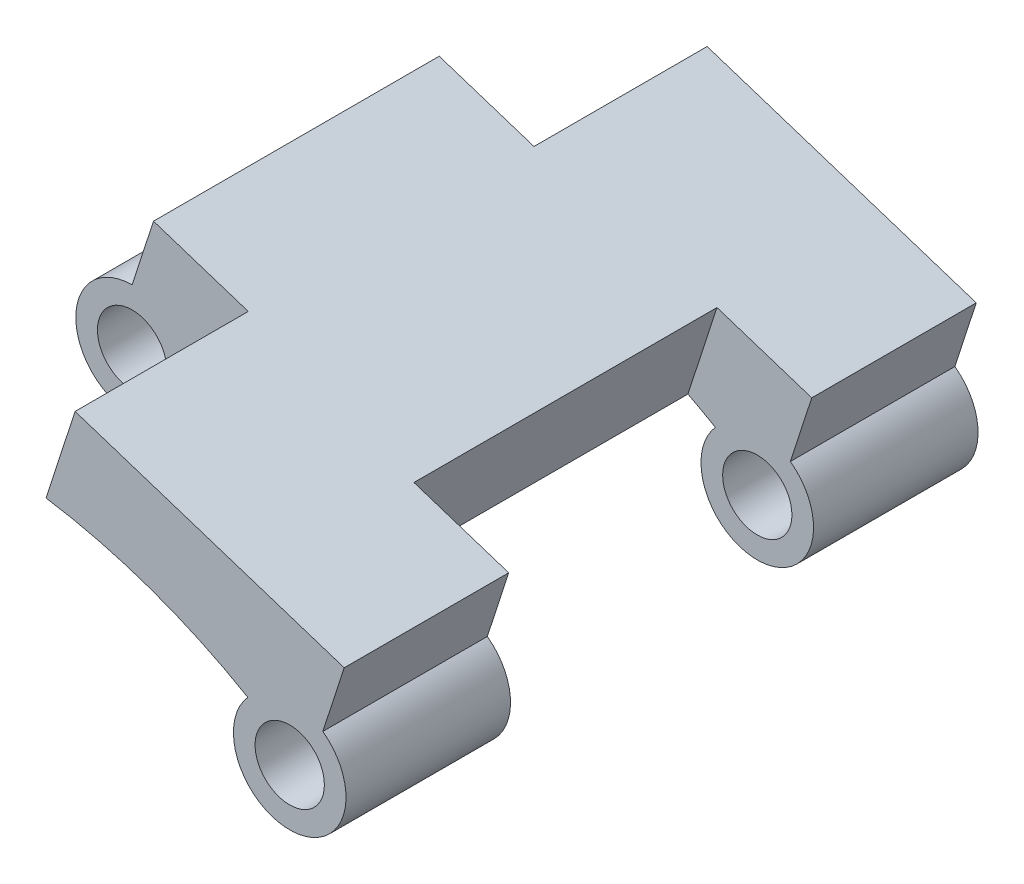
ISO-10303-21;
HEADER;
FILE_DESCRIPTION(('STEP AP214'),'2;1');
FILE_NAME('part.step','',(''),(''),'','','');
FILE_SCHEMA(('AUTOMOTIVE_DESIGN { 1 0 10303 214 1 1 1 1 }'));
ENDSEC;
DATA;
#1=APPLICATION_CONTEXT('core data for automotive mechanical design processes');
#2=APPLICATION_PROTOCOL_DEFINITION('international standard','automotive_design',2000,#1);
#3=PRODUCT_CONTEXT('',#1,'mechanical');
#4=PRODUCT('Part','Part','',(#3));
#5=PRODUCT_RELATED_PRODUCT_CATEGORY('part','',(#4));
#6=PRODUCT_DEFINITION_FORMATION('','',#4);
#7=PRODUCT_DEFINITION_CONTEXT('part definition',#1,'design');
#8=PRODUCT_DEFINITION('design','',#6,#7);
#9=PRODUCT_DEFINITION_SHAPE('','',#8);
#10=(LENGTH_UNIT() NAMED_UNIT(*) SI_UNIT(.MILLI.,.METRE.));
#11=(NAMED_UNIT(*) PLANE_ANGLE_UNIT() SI_UNIT($,.RADIAN.));
#12=(NAMED_UNIT(*) SI_UNIT($,.STERADIAN.) SOLID_ANGLE_UNIT());
#13=UNCERTAINTY_MEASURE_WITH_UNIT(LENGTH_MEASURE(1.E-05),#10,'distance_accuracy_value','');
#14=(GEOMETRIC_REPRESENTATION_CONTEXT(3) GLOBAL_UNCERTAINTY_ASSIGNED_CONTEXT((#13)) GLOBAL_UNIT_ASSIGNED_CONTEXT((#10,
#11,#12)) REPRESENTATION_CONTEXT('',''));
#15=CARTESIAN_POINT('',(0.,0.,0.));
#16=DIRECTION('',(0.,0.,1.));
#17=DIRECTION('',(1.,0.,0.));
#18=AXIS2_PLACEMENT_3D('',#15,#16,#17);
#19=CARTESIAN_POINT('',(6.54378432662025,33.5383952836735,-30.));
#20=DIRECTION('',(0.,0.,1.));
#21=DIRECTION('',(1.,0.,0.));
#22=AXIS2_PLACEMENT_3D('',#19,#20,#21);
#23=CYLINDRICAL_SURFACE('',#22,2.);
#24=CARTESIAN_POINT('',(6.54378432662025,33.5383952836735,-3.5));
#25=DIRECTION('',(0.,0.,-1.));
#26=DIRECTION('',(-1.,0.,0.));
#27=AXIS2_PLACEMENT_3D('',#24,#25,#26);
#28=CIRCLE('',#27,2.);
#29=CARTESIAN_POINT('',(4.54378432662025,33.5383952836735,-3.5));
#30=VERTEX_POINT('',#29);
#31=EDGE_CURVE('E305',#30,#30,#28,.F.);
#32=ORIENTED_EDGE('',*,*,#31,.T.);
#33=EDGE_LOOP('',(#32));
#34=FACE_BOUND('',#33,.T.);
#35=CARTESIAN_POINT('',(6.54378432662025,33.5383952836735,-20.));
#36=DIRECTION('',(0.,0.,1.));
#37=DIRECTION('',(1.,0.,0.));
#38=AXIS2_PLACEMENT_3D('',#35,#36,#37);
#39=CIRCLE('',#38,2.);
#40=CARTESIAN_POINT('',(8.54378432662025,33.5383952836735,-20.));
#41=VERTEX_POINT('',#40);
#42=EDGE_CURVE('E301',#41,#41,#39,.F.);
#43=ORIENTED_EDGE('',*,*,#42,.T.);
#44=EDGE_LOOP('',(#43));
#45=FACE_BOUND('',#44,.T.);
#46=ADVANCED_FACE('F118',(#34,#45),#23,.F.);
#47=CARTESIAN_POINT('',(-0.536270226362876,22.2654488705289,-3.5));
#48=DIRECTION('',(0.,0.,-1.));
#49=DIRECTION('',(-1.,0.,0.));
#50=AXIS2_PLACEMENT_3D('',#47,#48,#49);
#51=PLANE('',#50);
#52=ORIENTED_EDGE('',*,*,#31,.F.);
#53=EDGE_LOOP('',(#52));
#54=FACE_BOUND('',#53,.T.);
#55=CARTESIAN_POINT('',(6.54378432662025,33.5383952836735,-3.5));
#56=DIRECTION('',(0.,0.,-1.));
#57=DIRECTION('',(-1.,0.,0.));
#58=AXIS2_PLACEMENT_3D('',#55,#56,#57);
#59=CIRCLE('',#58,3.24999999999999);
#60=CARTESIAN_POINT('',(6.54378432662025,36.7883952836734,-3.5));
#61=VERTEX_POINT('',#60);
#62=CARTESIAN_POINT('',(9.77675310371405,33.8706796292821,-3.5));
#63=VERTEX_POINT('',#62);
#64=EDGE_CURVE('E308',#61,#63,#59,.F.);
#65=ORIENTED_EDGE('',*,*,#64,.T.);
#66=CARTESIAN_POINT('',(6.54378432662025,1.03839528367346,-3.5));
#67=DIRECTION('',(0.,0.,-1.));
#68=DIRECTION('',(-1.,0.,0.));
#69=AXIS2_PLACEMENT_3D('',#66,#67,#68);
#70=CIRCLE('',#69,32.9910742847905);
#71=CARTESIAN_POINT('',(11.5725292331081,33.6439578019008,-3.5));
#72=VERTEX_POINT('',#71);
#73=EDGE_CURVE('E353',#72,#63,#70,.F.);
#74=ORIENTED_EDGE('',*,*,#73,.F.);
#75=DIRECTION('',(0.309016994374947,0.951056516295154,0.));
#76=VECTOR('',#75,1.);
#77=CARTESIAN_POINT('',(7.07218190399835,19.7933129155293,-3.5));
#78=LINE('',#77,#76);
#79=CARTESIAN_POINT('',(13.2525217914973,38.8144432414324,-3.5));
#80=VERTEX_POINT('',#79);
#81=EDGE_CURVE('E369',#72,#80,#78,.T.);
#82=ORIENTED_EDGE('',*,*,#81,.T.);
#83=DIRECTION('',(-0.951056516295154,0.309016994374947,0.));
#84=VECTOR('',#83,1.);
#85=CARTESIAN_POINT('',(5.64406966113607,41.2865791964319,-3.5));
#86=LINE('',#85,#84);
#87=CARTESIAN_POINT('',(7.77985230412004,40.5926213488541,-3.5));
#88=VERTEX_POINT('',#87);
#89=EDGE_CURVE('E246',#80,#88,#86,.T.);
#90=ORIENTED_EDGE('',*,*,#89,.T.);
#91=DIRECTION('',(0.309016994374947,0.951056516295154,0.));
#92=VECTOR('',#91,1.);
#93=CARTESIAN_POINT('',(6.54378432662025,36.7883952836735,-3.5));
#94=LINE('',#93,#92);
#95=EDGE_CURVE('E313',#61,#88,#94,.T.);
#96=ORIENTED_EDGE('',*,*,#95,.F.);
#97=EDGE_LOOP('',(#65,#74,#82,#90,#96));
#98=FACE_BOUND('',#97,.T.);
#99=ADVANCED_FACE('F381',(#54,#98),#51,.F.);
#100=CARTESIAN_POINT('',(7.07218190399835,19.7933129155293,6.5));
#101=DIRECTION('',(0.951056516295154,-0.309016994374947,0.));
#102=DIRECTION('',(0.309016994374947,0.951056516295154,0.));
#103=AXIS2_PLACEMENT_3D('',#100,#101,#102);
#104=PLANE('',#103);
#105=DIRECTION('',(0.309016994374947,0.951056516295154,0.));
#106=VECTOR('',#105,1.);
#107=CARTESIAN_POINT('',(11.0613027790222,32.0705645603925,6.5));
#108=LINE('',#107,#106);
#109=CARTESIAN_POINT('',(11.5725292331081,33.6439578019008,6.5));
#110=VERTEX_POINT('',#109);
#111=CARTESIAN_POINT('',(13.2525217914973,38.8144432414324,6.5));
#112=VERTEX_POINT('',#111);
#113=EDGE_CURVE('E126',#110,#112,#108,.T.);
#114=ORIENTED_EDGE('',*,*,#113,.T.);
#115=DIRECTION('',(0.,0.,-1.));
#116=VECTOR('',#115,1.);
#117=CARTESIAN_POINT('',(13.2525217914973,38.8144432414324,6.5));
#118=LINE('',#117,#116);
#119=EDGE_CURVE('E229',#112,#80,#118,.T.);
#120=ORIENTED_EDGE('',*,*,#119,.T.);
#121=ORIENTED_EDGE('',*,*,#81,.F.);
#122=DIRECTION('',(0.,0.,1.));
#123=VECTOR('',#122,1.);
#124=CARTESIAN_POINT('',(11.5725292331081,33.6439578019008,-30.));
#125=LINE('',#124,#123);
#126=EDGE_CURVE('E232',#110,#72,#125,.F.);
#127=ORIENTED_EDGE('',*,*,#126,.F.);
#128=EDGE_LOOP('',(#114,#120,#121,#127));
#129=FACE_BOUND('',#128,.T.);
#130=ADVANCED_FACE('F227',(#129),#104,.F.);
#131=CARTESIAN_POINT('',(7.07218190399835,19.7933129155293,-30.));
#132=DIRECTION('',(0.951056516295154,-0.309016994374947,0.));
#133=DIRECTION('',(0.309016994374947,0.951056516295154,0.));
#134=AXIS2_PLACEMENT_3D('',#131,#132,#133);
#135=PLANE('',#134);
#136=DIRECTION('',(0.309016994374947,0.951056516295154,0.));
#137=VECTOR('',#136,1.);
#138=CARTESIAN_POINT('',(7.07218190399836,19.7933129155293,-20.));
#139=LINE('',#138,#137);
#140=CARTESIAN_POINT('',(11.5725292331081,33.6439578019008,-20.));
#141=VERTEX_POINT('',#140);
#142=CARTESIAN_POINT('',(13.2525217914973,38.8144432414324,-20.));
#143=VERTEX_POINT('',#142);
#144=EDGE_CURVE('E362',#141,#143,#139,.T.);
#145=ORIENTED_EDGE('',*,*,#144,.T.);
#146=DIRECTION('',(0.,0.,-1.));
#147=VECTOR('',#146,1.);
#148=CARTESIAN_POINT('',(13.2525217914973,38.8144432414324,-30.));
#149=LINE('',#148,#147);
#150=CARTESIAN_POINT('',(13.2525217914973,38.8144432414324,-30.));
#151=VERTEX_POINT('',#150);
#152=EDGE_CURVE('E141',#143,#151,#149,.T.);
#153=ORIENTED_EDGE('',*,*,#152,.T.);
#154=DIRECTION('',(0.309016994374947,0.951056516295154,0.));
#155=VECTOR('',#154,1.);
#156=CARTESIAN_POINT('',(7.07218190399835,19.7933129155293,-30.));
#157=LINE('',#156,#155);
#158=CARTESIAN_POINT('',(11.5725292331081,33.6439578019008,-30.));
#159=VERTEX_POINT('',#158);
#160=EDGE_CURVE('E345',#159,#151,#157,.T.);
#161=ORIENTED_EDGE('',*,*,#160,.F.);
#162=DIRECTION('',(0.,0.,1.));
#163=VECTOR('',#162,1.);
#164=CARTESIAN_POINT('',(11.5725292331081,33.6439578019008,-30.));
#165=LINE('',#164,#163);
#166=EDGE_CURVE('E260',#141,#159,#165,.F.);
#167=ORIENTED_EDGE('',*,*,#166,.F.);
#168=EDGE_LOOP('',(#145,#153,#161,#167));
#169=FACE_BOUND('',#168,.T.);
#170=ADVANCED_FACE('F507',(#169),#135,.F.);
#171=CARTESIAN_POINT('',(-0.536270226362874,22.2654488705289,-20.));
#172=DIRECTION('',(0.,0.,1.));
#173=DIRECTION('',(1.,0.,0.));
#174=AXIS2_PLACEMENT_3D('',#171,#172,#173);
#175=PLANE('',#174);
#176=ORIENTED_EDGE('',*,*,#42,.F.);
#177=EDGE_LOOP('',(#176));
#178=FACE_BOUND('',#177,.T.);
#179=DIRECTION('',(0.951056516295154,-0.309016994374947,0.));
#180=VECTOR('',#179,1.);
#181=CARTESIAN_POINT('',(5.64406966113607,41.2865791964319,-20.));
#182=LINE('',#181,#180);
#183=CARTESIAN_POINT('',(7.77985230412004,40.5926213488541,-20.));
#184=VERTEX_POINT('',#183);
#185=EDGE_CURVE('E366',#184,#143,#182,.T.);
#186=ORIENTED_EDGE('',*,*,#185,.T.);
#187=ORIENTED_EDGE('',*,*,#144,.F.);
#188=CARTESIAN_POINT('',(6.54378432662025,1.03839528367346,-20.));
#189=DIRECTION('',(0.,0.,1.));
#190=DIRECTION('',(1.,0.,0.));
#191=AXIS2_PLACEMENT_3D('',#188,#189,#190);
#192=CIRCLE('',#191,32.9910742847905);
#193=CARTESIAN_POINT('',(9.77675310371405,33.8706796292821,-20.));
#194=VERTEX_POINT('',#193);
#195=EDGE_CURVE('E340',#194,#141,#192,.F.);
#196=ORIENTED_EDGE('',*,*,#195,.F.);
#197=CARTESIAN_POINT('',(6.54378432662025,33.5383952836735,-20.));
#198=DIRECTION('',(0.,0.,1.));
#199=DIRECTION('',(1.,0.,0.));
#200=AXIS2_PLACEMENT_3D('',#197,#198,#199);
#201=CIRCLE('',#200,3.24999999999999);
#202=CARTESIAN_POINT('',(6.54378432662025,36.7883952836734,-20.));
#203=VERTEX_POINT('',#202);
#204=EDGE_CURVE('E304',#194,#203,#201,.F.);
#205=ORIENTED_EDGE('',*,*,#204,.T.);
#206=DIRECTION('',(-0.309016994374947,-0.951056516295154,0.));
#207=VECTOR('',#206,1.);
#208=CARTESIAN_POINT('',(6.54378432662025,36.7883952836735,-20.));
#209=LINE('',#208,#207);
#210=EDGE_CURVE('E309',#184,#203,#209,.T.);
#211=ORIENTED_EDGE('',*,*,#210,.F.);
#212=EDGE_LOOP('',(#186,#187,#196,#205,#211));
#213=FACE_BOUND('',#212,.T.);
#214=ADVANCED_FACE('F388',(#178,#213),#175,.F.);
#215=CARTESIAN_POINT('',(25.6468050261256,27.3314476008593,-30.));
#216=DIRECTION('',(0.,0.,1.));
#217=DIRECTION('',(1.,0.,0.));
#218=AXIS2_PLACEMENT_3D('',#215,#216,#217);
#219=CYLINDRICAL_SURFACE('',#218,2.);
#220=CARTESIAN_POINT('',(25.6468050261256,27.3314476008593,-20.5));
#221=DIRECTION('',(0.,0.,-1.));
#222=DIRECTION('',(-1.,0.,0.));
#223=AXIS2_PLACEMENT_3D('',#220,#221,#222);
#224=CIRCLE('',#223,2.);
#225=CARTESIAN_POINT('',(23.6468050261256,27.3314476008593,-20.5));
#226=VERTEX_POINT('',#225);
#227=EDGE_CURVE('E310',#226,#226,#224,.F.);
#228=ORIENTED_EDGE('',*,*,#227,.T.);
#229=EDGE_LOOP('',(#228));
#230=FACE_BOUND('',#229,.T.);
#231=CARTESIAN_POINT('',(25.6468050261256,27.3314476008593,-30.));
#232=DIRECTION('',(0.,0.,1.));
#233=DIRECTION('',(1.,0.,0.));
#234=AXIS2_PLACEMENT_3D('',#231,#232,#233);
#235=CIRCLE('',#234,2.);
#236=CARTESIAN_POINT('',(27.6468050261256,27.3314476008593,-30.));
#237=VERTEX_POINT('',#236);
#238=EDGE_CURVE('E267',#237,#237,#235,.T.);
#239=ORIENTED_EDGE('',*,*,#238,.F.);
#240=EDGE_LOOP('',(#239));
#241=FACE_BOUND('',#240,.T.);
#242=ADVANCED_FACE('F430',(#230,#241),#219,.F.);
#243=CARTESIAN_POINT('',(25.6468050261256,27.3314476008593,-30.));
#244=DIRECTION('',(0.,0.,1.));
#245=DIRECTION('',(1.,0.,0.));
#246=AXIS2_PLACEMENT_3D('',#243,#244,#245);
#247=PLANE('',#246);
#248=ORIENTED_EDGE('',*,*,#238,.T.);
#249=EDGE_LOOP('',(#248));
#250=FACE_BOUND('',#249,.T.);
#251=CARTESIAN_POINT('',(6.54378432662025,1.03839528367346,-30.));
#252=DIRECTION('',(0.,0.,1.));
#253=DIRECTION('',(1.,0.,0.));
#254=AXIS2_PLACEMENT_3D('',#251,#252,#253);
#255=CIRCLE('',#254,32.9910742847905);
#256=CARTESIAN_POINT('',(23.2265901810896,29.5005626517192,-30.));
#257=VERTEX_POINT('',#256);
#258=EDGE_CURVE('E279',#257,#159,#255,.T.);
#259=ORIENTED_EDGE('',*,*,#258,.T.);
#260=ORIENTED_EDGE('',*,*,#160,.T.);
#261=DIRECTION('',(-0.951056516295154,0.309016994374947,0.));
#262=VECTOR('',#261,1.);
#263=CARTESIAN_POINT('',(28.793175073576,33.7649788977584,-30.));
#264=LINE('',#263,#262);
#265=CARTESIAN_POINT('',(28.793175073576,33.7649788977584,-30.));
#266=VERTEX_POINT('',#265);
#267=EDGE_CURVE('E270',#266,#151,#264,.T.);
#268=ORIENTED_EDGE('',*,*,#267,.F.);
#269=DIRECTION('',(0.309016994374948,0.951056516295154,0.));
#270=VECTOR('',#269,1.);
#271=CARTESIAN_POINT('',(27.5571070960762,29.9607528325778,-30.));
#272=LINE('',#271,#270);
#273=CARTESIAN_POINT('',(27.5571070960762,29.9607528325778,-30.));
#274=VERTEX_POINT('',#273);
#275=EDGE_CURVE('E273',#274,#266,#272,.T.);
#276=ORIENTED_EDGE('',*,*,#275,.F.);
#277=CARTESIAN_POINT('',(25.6468050261256,27.3314476008593,-30.));
#278=DIRECTION('',(0.,0.,1.));
#279=DIRECTION('',(1.,0.,0.));
#280=AXIS2_PLACEMENT_3D('',#277,#278,#279);
#281=CIRCLE('',#280,3.25);
#282=EDGE_CURVE('E276',#257,#274,#281,.T.);
#283=ORIENTED_EDGE('',*,*,#282,.F.);
#284=EDGE_LOOP('',(#259,#260,#268,#276,#283));
#285=FACE_BOUND('',#284,.T.);
#286=ADVANCED_FACE('F343',(#250,#285),#247,.F.);
#287=CARTESIAN_POINT('',(6.54378432662025,33.5383952836735,-30.));
#288=DIRECTION('',(0.,0.,1.));
#289=DIRECTION('',(1.,0.,0.));
#290=AXIS2_PLACEMENT_3D('',#287,#288,#289);
#291=CYLINDRICAL_SURFACE('',#290,3.24999999999999);
#292=DIRECTION('',(0.,0.,1.));
#293=VECTOR('',#292,1.);
#294=CARTESIAN_POINT('',(9.77675310371405,33.8706796292821,-30.));
#295=LINE('',#294,#293);
#296=EDGE_CURVE('E285',#194,#63,#295,.T.);
#297=ORIENTED_EDGE('',*,*,#296,.T.);
#298=ORIENTED_EDGE('',*,*,#64,.F.);
#299=DIRECTION('',(0.,0.,1.));
#300=VECTOR('',#299,1.);
#301=CARTESIAN_POINT('',(6.54378432662025,36.7883952836734,-30.));
#302=LINE('',#301,#300);
#303=EDGE_CURVE('E282',#203,#61,#302,.T.);
#304=ORIENTED_EDGE('',*,*,#303,.F.);
#305=ORIENTED_EDGE('',*,*,#204,.F.);
#306=EDGE_LOOP('',(#297,#298,#304,#305));
#307=FACE_BOUND('',#306,.T.);
#308=ADVANCED_FACE('F390',(#307),#291,.T.);
#309=CARTESIAN_POINT('',(25.6468050261256,27.3314476008593,6.5));
#310=DIRECTION('',(0.,0.,1.));
#311=DIRECTION('',(1.,0.,0.));
#312=AXIS2_PLACEMENT_3D('',#309,#310,#311);
#313=PLANE('',#312);
#314=ORIENTED_EDGE('',*,*,#113,.F.);
#315=CARTESIAN_POINT('',(6.54378432662025,1.03839528367346,6.5));
#316=DIRECTION('',(0.,0.,1.));
#317=DIRECTION('',(1.,0.,0.));
#318=AXIS2_PLACEMENT_3D('',#315,#316,#317);
#319=CIRCLE('',#318,32.9910742847905);
#320=CARTESIAN_POINT('',(23.2265901810896,29.5005626517192,6.5));
#321=VERTEX_POINT('',#320);
#322=EDGE_CURVE('E265',#321,#110,#319,.T.);
#323=ORIENTED_EDGE('',*,*,#322,.F.);
#324=CARTESIAN_POINT('',(25.6468050261256,27.3314476008593,6.5));
#325=DIRECTION('',(0.,0.,1.));
#326=DIRECTION('',(1.,0.,0.));
#327=AXIS2_PLACEMENT_3D('',#324,#325,#326);
#328=CIRCLE('',#327,3.25);
#329=CARTESIAN_POINT('',(27.5571070960762,29.9607528325778,6.5));
#330=VERTEX_POINT('',#329);
#331=EDGE_CURVE('E257',#321,#330,#328,.T.);
#332=ORIENTED_EDGE('',*,*,#331,.T.);
#333=DIRECTION('',(0.309016994374948,0.951056516295154,0.));
#334=VECTOR('',#333,1.);
#335=CARTESIAN_POINT('',(27.5571070960762,29.9607528325778,6.5));
#336=LINE('',#335,#334);
#337=CARTESIAN_POINT('',(28.793175073576,33.7649788977584,6.5));
#338=VERTEX_POINT('',#337);
#339=EDGE_CURVE('E254',#330,#338,#336,.T.);
#340=ORIENTED_EDGE('',*,*,#339,.T.);
#341=DIRECTION('',(-0.951056516295154,0.309016994374947,0.));
#342=VECTOR('',#341,1.);
#343=CARTESIAN_POINT('',(28.793175073576,33.7649788977584,6.5));
#344=LINE('',#343,#342);
#345=EDGE_CURVE('E244',#338,#112,#344,.T.);
#346=ORIENTED_EDGE('',*,*,#345,.T.);
#347=EDGE_LOOP('',(#314,#323,#332,#340,#346));
#348=FACE_BOUND('',#347,.T.);
#349=CARTESIAN_POINT('',(25.6468050261256,27.3314476008593,6.5));
#350=DIRECTION('',(0.,0.,1.));
#351=DIRECTION('',(1.,0.,0.));
#352=AXIS2_PLACEMENT_3D('',#349,#350,#351);
#353=CIRCLE('',#352,2.);
#354=CARTESIAN_POINT('',(27.6468050261256,27.3314476008593,6.5));
#355=VERTEX_POINT('',#354);
#356=EDGE_CURVE('E255',#355,#355,#353,.T.);
#357=ORIENTED_EDGE('',*,*,#356,.F.);
#358=EDGE_LOOP('',(#357));
#359=FACE_BOUND('',#358,.T.);
#360=ADVANCED_FACE('F250',(#348,#359),#313,.T.);
#361=CARTESIAN_POINT('',(25.6468050261256,27.3314476008593,-3.));
#362=DIRECTION('',(0.,0.,1.));
#363=DIRECTION('',(1.,0.,0.));
#364=AXIS2_PLACEMENT_3D('',#361,#362,#363);
#365=CIRCLE('',#364,2.);
#366=CARTESIAN_POINT('',(27.6468050261256,27.3314476008593,-3.));
#367=VERTEX_POINT('',#366);
#368=EDGE_CURVE('E314',#367,#367,#365,.F.);
#369=ORIENTED_EDGE('',*,*,#368,.T.);
#370=EDGE_LOOP('',(#369));
#371=FACE_BOUND('',#370,.T.);
#372=ORIENTED_EDGE('',*,*,#356,.T.);
#373=EDGE_LOOP('',(#372));
#374=FACE_BOUND('',#373,.T.);
#375=ADVANCED_FACE('F434',(#371,#374),#219,.F.);
#376=CARTESIAN_POINT('',(6.54378432662025,1.03839528367346,-30.));
#377=DIRECTION('',(0.,0.,1.));
#378=DIRECTION('',(1.,0.,0.));
#379=AXIS2_PLACEMENT_3D('',#376,#377,#378);
#380=CYLINDRICAL_SURFACE('',#379,32.9910742847905);
#381=DIRECTION('',(0.,0.,1.));
#382=VECTOR('',#381,1.);
#383=CARTESIAN_POINT('',(21.6405130278095,30.3726715656486,-30.));
#384=LINE('',#383,#382);
#385=CARTESIAN_POINT('',(21.6405130278095,30.3726715656486,-20.5));
#386=VERTEX_POINT('',#385);
#387=CARTESIAN_POINT('',(21.6405130278095,30.3726715656486,-3.));
#388=VERTEX_POINT('',#387);
#389=EDGE_CURVE('E12',#386,#388,#384,.T.);
#390=ORIENTED_EDGE('',*,*,#389,.T.);
#391=CARTESIAN_POINT('',(6.54378432662025,1.03839528367346,-3.));
#392=DIRECTION('',(0.,0.,1.));
#393=DIRECTION('',(1.,0.,0.));
#394=AXIS2_PLACEMENT_3D('',#391,#392,#393);
#395=CIRCLE('',#394,32.9910742847905);
#396=CARTESIAN_POINT('',(23.2265901810896,29.5005626517192,-3.));
#397=VERTEX_POINT('',#396);
#398=EDGE_CURVE('E316',#388,#397,#395,.F.);
#399=ORIENTED_EDGE('',*,*,#398,.T.);
#400=DIRECTION('',(0.,0.,1.));
#401=VECTOR('',#400,1.);
#402=CARTESIAN_POINT('',(23.2265901810896,29.5005626517192,-30.));
#403=LINE('',#402,#401);
#404=EDGE_CURVE('E288',#397,#321,#403,.T.);
#405=ORIENTED_EDGE('',*,*,#404,.T.);
#406=ORIENTED_EDGE('',*,*,#322,.T.);
#407=ORIENTED_EDGE('',*,*,#126,.T.);
#408=ORIENTED_EDGE('',*,*,#73,.T.);
#409=ORIENTED_EDGE('',*,*,#296,.F.);
#410=ORIENTED_EDGE('',*,*,#195,.T.);
#411=ORIENTED_EDGE('',*,*,#166,.T.);
#412=ORIENTED_EDGE('',*,*,#258,.F.);
#413=CARTESIAN_POINT('',(23.2265901810896,29.5005626517192,-20.5));
#414=VERTEX_POINT('',#413);
#415=EDGE_CURVE('E289',#257,#414,#403,.T.);
#416=ORIENTED_EDGE('',*,*,#415,.T.);
#417=CARTESIAN_POINT('',(6.54378432662025,1.03839528367346,-20.5));
#418=DIRECTION('',(0.,0.,-1.));
#419=DIRECTION('',(-1.,0.,0.));
#420=AXIS2_PLACEMENT_3D('',#417,#418,#419);
#421=CIRCLE('',#420,32.9910742847905);
#422=EDGE_CURVE('E312',#414,#386,#421,.F.);
#423=ORIENTED_EDGE('',*,*,#422,.T.);
#424=EDGE_LOOP('',(#390,#399,#405,#406,#407,#408,#409,#410,#411,#412,#416,#423));
#425=FACE_BOUND('',#424,.T.);
#426=ADVANCED_FACE('F336',(#425),#380,.F.);
#427=CARTESIAN_POINT('',(25.6468050261256,27.3314476008593,-30.));
#428=DIRECTION('',(0.,0.,1.));
#429=DIRECTION('',(1.,0.,0.));
#430=AXIS2_PLACEMENT_3D('',#427,#428,#429);
#431=CYLINDRICAL_SURFACE('',#430,3.25);
#432=CARTESIAN_POINT('',(25.6468050261256,27.3314476008593,-20.5));
#433=DIRECTION('',(0.,0.,-1.));
#434=DIRECTION('',(-1.,0.,0.));
#435=AXIS2_PLACEMENT_3D('',#432,#433,#434);
#436=CIRCLE('',#435,3.25);
#437=CARTESIAN_POINT('',(27.5571070960762,29.9607528325778,-20.5));
#438=VERTEX_POINT('',#437);
#439=EDGE_CURVE('E323',#414,#438,#436,.F.);
#440=ORIENTED_EDGE('',*,*,#439,.F.);
#441=ORIENTED_EDGE('',*,*,#415,.F.);
#442=ORIENTED_EDGE('',*,*,#282,.T.);
#443=DIRECTION('',(0.,0.,1.));
#444=VECTOR('',#443,1.);
#445=CARTESIAN_POINT('',(27.5571070960762,29.9607528325778,-30.));
#446=LINE('',#445,#444);
#447=EDGE_CURVE('E293',#274,#438,#446,.T.);
#448=ORIENTED_EDGE('',*,*,#447,.T.);
#449=EDGE_LOOP('',(#440,#441,#442,#448));
#450=FACE_BOUND('',#449,.T.);
#451=ADVANCED_FACE('F348',(#450),#431,.T.);
#452=ORIENTED_EDGE('',*,*,#404,.F.);
#453=CARTESIAN_POINT('',(25.6468050261256,27.3314476008593,-3.));
#454=DIRECTION('',(0.,0.,1.));
#455=DIRECTION('',(1.,0.,0.));
#456=AXIS2_PLACEMENT_3D('',#453,#454,#455);
#457=CIRCLE('',#456,3.25);
#458=CARTESIAN_POINT('',(27.5571070960762,29.9607528325778,-3.));
#459=VERTEX_POINT('',#458);
#460=EDGE_CURVE('E321',#459,#397,#457,.F.);
#461=ORIENTED_EDGE('',*,*,#460,.F.);
#462=EDGE_CURVE('E292',#459,#330,#446,.T.);
#463=ORIENTED_EDGE('',*,*,#462,.T.);
#464=ORIENTED_EDGE('',*,*,#331,.F.);
#465=EDGE_LOOP('',(#452,#461,#463,#464));
#466=FACE_BOUND('',#465,.T.);
#467=ADVANCED_FACE('F411',(#466),#431,.T.);
#468=CARTESIAN_POINT('',(27.5571070960762,29.9607528325778,-30.));
#469=DIRECTION('',(0.951056516295153,-0.309016994374948,0.));
#470=DIRECTION('',(0.309016994374948,0.951056516295154,0.));
#471=AXIS2_PLACEMENT_3D('',#468,#469,#470);
#472=PLANE('',#471);
#473=DIRECTION('',(0.309016994374948,0.951056516295154,0.));
#474=VECTOR('',#473,1.);
#475=CARTESIAN_POINT('',(27.5571070960762,29.9607528325778,-20.5));
#476=LINE('',#475,#474);
#477=CARTESIAN_POINT('',(28.793175073576,33.7649788977584,-20.5));
#478=VERTEX_POINT('',#477);
#479=EDGE_CURVE('E317',#438,#478,#476,.T.);
#480=ORIENTED_EDGE('',*,*,#479,.F.);
#481=ORIENTED_EDGE('',*,*,#447,.F.);
#482=ORIENTED_EDGE('',*,*,#275,.T.);
#483=DIRECTION('',(0.,0.,1.));
#484=VECTOR('',#483,1.);
#485=CARTESIAN_POINT('',(28.793175073576,33.7649788977584,-30.));
#486=LINE('',#485,#484);
#487=EDGE_CURVE('E297',#266,#478,#486,.T.);
#488=ORIENTED_EDGE('',*,*,#487,.T.);
#489=EDGE_LOOP('',(#480,#481,#482,#488));
#490=FACE_BOUND('',#489,.T.);
#491=ADVANCED_FACE('F409',(#490),#472,.T.);
#492=DIRECTION('',(-0.309016994374948,-0.951056516295154,0.));
#493=VECTOR('',#492,1.);
#494=CARTESIAN_POINT('',(27.5571070960762,29.9607528325778,-3.));
#495=LINE('',#494,#493);
#496=CARTESIAN_POINT('',(28.793175073576,33.7649788977584,-3.));
#497=VERTEX_POINT('',#496);
#498=EDGE_CURVE('E331',#497,#459,#495,.T.);
#499=ORIENTED_EDGE('',*,*,#498,.F.);
#500=EDGE_CURVE('E296',#497,#338,#486,.T.);
#501=ORIENTED_EDGE('',*,*,#500,.T.);
#502=ORIENTED_EDGE('',*,*,#339,.F.);
#503=ORIENTED_EDGE('',*,*,#462,.F.);
#504=EDGE_LOOP('',(#499,#501,#502,#503));
#505=FACE_BOUND('',#504,.T.);
#506=ADVANCED_FACE('F397',(#505),#472,.T.);
#507=CARTESIAN_POINT('',(28.793175073576,33.7649788977584,-30.));
#508=DIRECTION('',(0.309016994374947,0.951056516295154,0.));
#509=DIRECTION('',(-0.951056516295154,0.309016994374947,0.));
#510=AXIS2_PLACEMENT_3D('',#507,#508,#509);
#511=PLANE('',#510);
#512=DIRECTION('',(0.951056516295154,-0.309016994374947,0.));
#513=VECTOR('',#512,1.);
#514=CARTESIAN_POINT('',(30.9289577165599,33.0710210501806,-3.));
#515=LINE('',#514,#513);
#516=CARTESIAN_POINT('',(23.3205055861987,35.5431570051802,-3.));
#517=VERTEX_POINT('',#516);
#518=EDGE_CURVE('E371',#517,#497,#515,.T.);
#519=ORIENTED_EDGE('',*,*,#518,.F.);
#520=DIRECTION('',(0.,0.,1.));
#521=VECTOR('',#520,1.);
#522=CARTESIAN_POINT('',(23.3205055861987,35.5431570051802,-20.5));
#523=LINE('',#522,#521);
#524=CARTESIAN_POINT('',(23.3205055861987,35.5431570051802,-20.5));
#525=VERTEX_POINT('',#524);
#526=EDGE_CURVE('E374',#525,#517,#523,.T.);
#527=ORIENTED_EDGE('',*,*,#526,.F.);
#528=DIRECTION('',(-0.951056516295154,0.309016994374947,0.));
#529=VECTOR('',#528,1.);
#530=CARTESIAN_POINT('',(30.9289577165599,33.0710210501806,-20.5));
#531=LINE('',#530,#529);
#532=EDGE_CURVE('E377',#478,#525,#531,.T.);
#533=ORIENTED_EDGE('',*,*,#532,.F.);
#534=ORIENTED_EDGE('',*,*,#487,.F.);
#535=ORIENTED_EDGE('',*,*,#267,.T.);
#536=ORIENTED_EDGE('',*,*,#152,.F.);
#537=ORIENTED_EDGE('',*,*,#185,.F.);
#538=DIRECTION('',(0.,0.,1.));
#539=VECTOR('',#538,1.);
#540=CARTESIAN_POINT('',(7.77985230412004,40.5926213488541,-30.));
#541=LINE('',#540,#539);
#542=EDGE_CURVE('E237',#184,#88,#541,.T.);
#543=ORIENTED_EDGE('',*,*,#542,.T.);
#544=ORIENTED_EDGE('',*,*,#89,.F.);
#545=ORIENTED_EDGE('',*,*,#119,.F.);
#546=ORIENTED_EDGE('',*,*,#345,.F.);
#547=ORIENTED_EDGE('',*,*,#500,.F.);
#548=EDGE_LOOP('',(#519,#527,#533,#534,#535,#536,#537,#543,#544,#545,#546,#547));
#549=FACE_BOUND('',#548,.T.);
#550=ADVANCED_FACE('F242',(#549),#511,.T.);
#551=CARTESIAN_POINT('',(6.54378432662025,36.7883952836735,-30.));
#552=DIRECTION('',(0.951056516295154,-0.309016994374947,0.));
#553=DIRECTION('',(0.309016994374947,0.951056516295154,0.));
#554=AXIS2_PLACEMENT_3D('',#551,#552,#553);
#555=PLANE('',#554);
#556=ORIENTED_EDGE('',*,*,#303,.T.);
#557=ORIENTED_EDGE('',*,*,#95,.T.);
#558=ORIENTED_EDGE('',*,*,#542,.F.);
#559=ORIENTED_EDGE('',*,*,#210,.T.);
#560=EDGE_LOOP('',(#556,#557,#558,#559));
#561=FACE_BOUND('',#560,.T.);
#562=ADVANCED_FACE('F120',(#561),#555,.F.);
#563=CARTESIAN_POINT('',(17.1401656986998,16.5220266792771,-20.5));
#564=DIRECTION('',(-0.951056516295154,0.309016994374947,0.));
#565=DIRECTION('',(-0.309016994374947,-0.951056516295154,0.));
#566=AXIS2_PLACEMENT_3D('',#563,#564,#565);
#567=PLANE('',#566);
#568=DIRECTION('',(0.309016994374947,0.951056516295154,0.));
#569=VECTOR('',#568,1.);
#570=CARTESIAN_POINT('',(17.1401656986998,16.5220266792771,-20.5));
#571=LINE('',#570,#569);
#572=EDGE_CURVE('E133',#386,#525,#571,.T.);
#573=ORIENTED_EDGE('',*,*,#572,.T.);
#574=ORIENTED_EDGE('',*,*,#526,.T.);
#575=DIRECTION('',(0.309016994374947,0.951056516295154,0.));
#576=VECTOR('',#575,1.);
#577=CARTESIAN_POINT('',(17.1401656986998,16.5220266792771,-3.));
#578=LINE('',#577,#576);
#579=EDGE_CURVE('E247',#388,#517,#578,.T.);
#580=ORIENTED_EDGE('',*,*,#579,.F.);
#581=ORIENTED_EDGE('',*,*,#389,.F.);
#582=EDGE_LOOP('',(#573,#574,#580,#581));
#583=FACE_BOUND('',#582,.T.);
#584=ADVANCED_FACE('F405',(#583),#567,.F.);
#585=CARTESIAN_POINT('',(24.748617829061,14.0498907242775,-3.));
#586=DIRECTION('',(0.,0.,1.));
#587=DIRECTION('',(1.,0.,0.));
#588=AXIS2_PLACEMENT_3D('',#585,#586,#587);
#589=PLANE('',#588);
#590=ORIENTED_EDGE('',*,*,#498,.T.);
#591=ORIENTED_EDGE('',*,*,#460,.T.);
#592=ORIENTED_EDGE('',*,*,#398,.F.);
#593=ORIENTED_EDGE('',*,*,#579,.T.);
#594=ORIENTED_EDGE('',*,*,#518,.T.);
#595=EDGE_LOOP('',(#590,#591,#592,#593,#594));
#596=FACE_BOUND('',#595,.T.);
#597=ORIENTED_EDGE('',*,*,#368,.F.);
#598=EDGE_LOOP('',(#597));
#599=FACE_BOUND('',#598,.T.);
#600=ADVANCED_FACE('F400',(#596,#599),#589,.F.);
#601=CARTESIAN_POINT('',(24.748617829061,14.0498907242775,-20.5));
#602=DIRECTION('',(0.,0.,-1.));
#603=DIRECTION('',(-1.,0.,0.));
#604=AXIS2_PLACEMENT_3D('',#601,#602,#603);
#605=PLANE('',#604);
#606=ORIENTED_EDGE('',*,*,#479,.T.);
#607=ORIENTED_EDGE('',*,*,#532,.T.);
#608=ORIENTED_EDGE('',*,*,#572,.F.);
#609=ORIENTED_EDGE('',*,*,#422,.F.);
#610=ORIENTED_EDGE('',*,*,#439,.T.);
#611=EDGE_LOOP('',(#606,#607,#608,#609,#610));
#612=FACE_BOUND('',#611,.T.);
#613=ORIENTED_EDGE('',*,*,#227,.F.);
#614=EDGE_LOOP('',(#613));
#615=FACE_BOUND('',#614,.T.);
#616=ADVANCED_FACE('F406',(#612,#615),#605,.F.);
#617=CLOSED_SHELL('',(#46,#99,#130,#170,#214,#242,#286,#308,#360,#375,#426,#451,#467,#491,#506,
#550,#562,#584,#600,#616));
#618=MANIFOLD_SOLID_BREP('B2',#617);
#619=ADVANCED_BREP_SHAPE_REPRESENTATION('',(#18,#618),#14);
#620=SHAPE_DEFINITION_REPRESENTATION(#9,#619);
ENDSEC;
END-ISO-10303-21;
